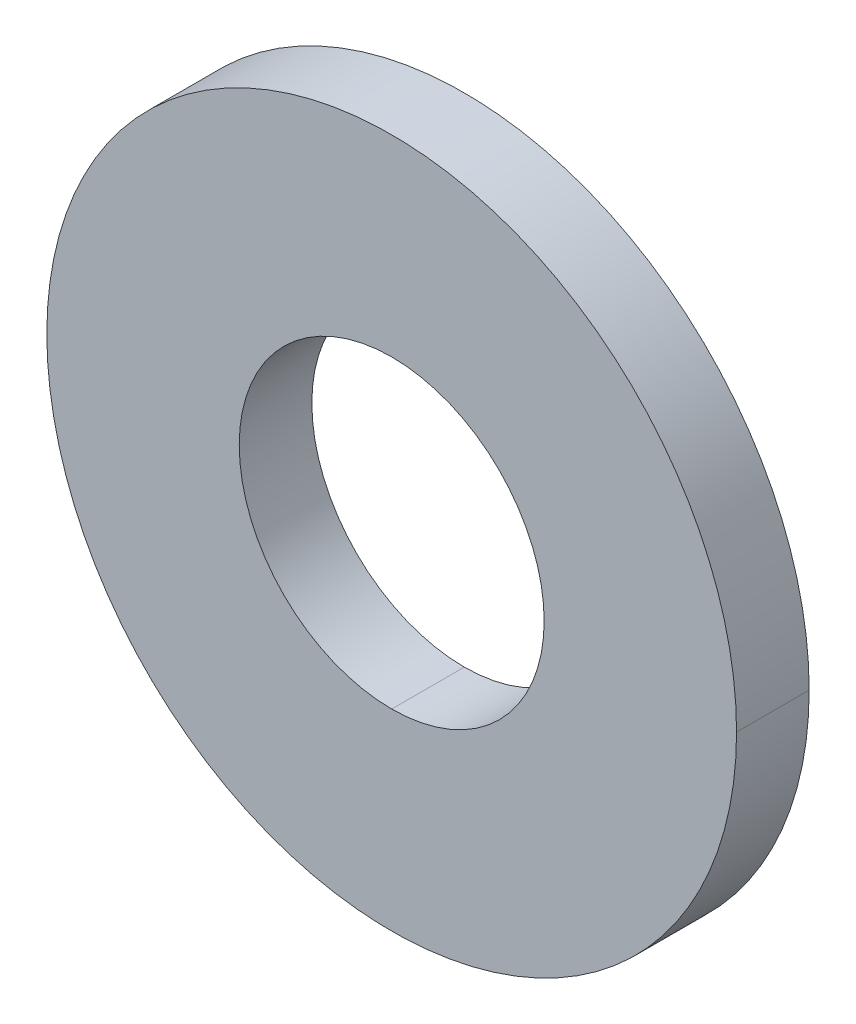
ISO-10303-21;
HEADER;
FILE_DESCRIPTION(('STEP AP214'),'2;1');
FILE_NAME('part.step','',(''),(''),'','','');
FILE_SCHEMA(('AUTOMOTIVE_DESIGN { 1 0 10303 214 1 1 1 1 }'));
ENDSEC;
DATA;
#1=APPLICATION_CONTEXT('core data for automotive mechanical design processes');
#2=APPLICATION_PROTOCOL_DEFINITION('international standard','automotive_design',2000,#1);
#3=PRODUCT_CONTEXT('',#1,'mechanical');
#4=PRODUCT('Part','Part','',(#3));
#5=PRODUCT_RELATED_PRODUCT_CATEGORY('part','',(#4));
#6=PRODUCT_DEFINITION_FORMATION('','',#4);
#7=PRODUCT_DEFINITION_CONTEXT('part definition',#1,'design');
#8=PRODUCT_DEFINITION('design','',#6,#7);
#9=PRODUCT_DEFINITION_SHAPE('','',#8);
#10=(LENGTH_UNIT() NAMED_UNIT(*) SI_UNIT(.MILLI.,.METRE.));
#11=(NAMED_UNIT(*) PLANE_ANGLE_UNIT() SI_UNIT($,.RADIAN.));
#12=(NAMED_UNIT(*) SI_UNIT($,.STERADIAN.) SOLID_ANGLE_UNIT());
#13=UNCERTAINTY_MEASURE_WITH_UNIT(LENGTH_MEASURE(1.E-05),#10,'distance_accuracy_value','');
#14=(GEOMETRIC_REPRESENTATION_CONTEXT(3) GLOBAL_UNCERTAINTY_ASSIGNED_CONTEXT((#13)) GLOBAL_UNIT_ASSIGNED_CONTEXT((#10,
#11,#12)) REPRESENTATION_CONTEXT('',''));
#15=CARTESIAN_POINT('',(0.,0.,0.));
#16=DIRECTION('',(0.,0.,1.));
#17=DIRECTION('',(1.,0.,0.));
#18=AXIS2_PLACEMENT_3D('',#15,#16,#17);
#19=CARTESIAN_POINT('',(0.,0.,0.));
#20=DIRECTION('',(0.,0.,-1.));
#21=DIRECTION('',(0.,-1.,0.));
#22=AXIS2_PLACEMENT_3D('',#19,#20,#21);
#23=PLANE('',#22);
#24=CARTESIAN_POINT('',(0.,0.,0.));
#25=DIRECTION('',(0.,0.,-1.));
#26=DIRECTION('',(1.,0.,0.));
#27=AXIS2_PLACEMENT_3D('',#24,#25,#26);
#28=CIRCLE('',#27,4.75);
#29=CARTESIAN_POINT('',(4.75,0.,0.));
#30=VERTEX_POINT('',#29);
#31=CARTESIAN_POINT('',(-4.75,0.,0.));
#32=VERTEX_POINT('',#31);
#33=EDGE_CURVE('E11',#30,#32,#28,.T.);
#34=ORIENTED_EDGE('',*,*,#33,.T.);
#35=CARTESIAN_POINT('',(0.,0.,0.));
#36=DIRECTION('',(0.,0.,-1.));
#37=DIRECTION('',(1.,0.,0.));
#38=AXIS2_PLACEMENT_3D('',#35,#36,#37);
#39=CIRCLE('',#38,4.75);
#40=EDGE_CURVE('E27',#32,#30,#39,.T.);
#41=ORIENTED_EDGE('',*,*,#40,.T.);
#42=EDGE_LOOP('',(#34,#41));
#43=FACE_BOUND('',#42,.T.);
#44=CARTESIAN_POINT('',(0.,0.,0.));
#45=DIRECTION('',(0.,0.,-1.));
#46=DIRECTION('',(1.,0.,0.));
#47=AXIS2_PLACEMENT_3D('',#44,#45,#46);
#48=CIRCLE('',#47,2.09999999963);
#49=CARTESIAN_POINT('',(0.,2.09999999963,0.));
#50=VERTEX_POINT('',#49);
#51=CARTESIAN_POINT('',(2.09999999963,0.,0.));
#52=VERTEX_POINT('',#51);
#53=EDGE_CURVE('E88',#50,#52,#48,.T.);
#54=ORIENTED_EDGE('',*,*,#53,.F.);
#55=CARTESIAN_POINT('',(0.,0.,0.));
#56=DIRECTION('',(0.,0.,-1.));
#57=DIRECTION('',(1.,0.,0.));
#58=AXIS2_PLACEMENT_3D('',#55,#56,#57);
#59=CIRCLE('',#58,2.09999999963);
#60=CARTESIAN_POINT('',(-2.09999999963,0.,0.));
#61=VERTEX_POINT('',#60);
#62=EDGE_CURVE('E104',#61,#50,#59,.T.);
#63=ORIENTED_EDGE('',*,*,#62,.F.);
#64=CARTESIAN_POINT('',(0.,0.,0.));
#65=DIRECTION('',(0.,0.,-1.));
#66=DIRECTION('',(1.,0.,0.));
#67=AXIS2_PLACEMENT_3D('',#64,#65,#66);
#68=CIRCLE('',#67,2.09999999963);
#69=CARTESIAN_POINT('',(0.,-2.09999999963,0.));
#70=VERTEX_POINT('',#69);
#71=EDGE_CURVE('E80',#70,#61,#68,.T.);
#72=ORIENTED_EDGE('',*,*,#71,.F.);
#73=CARTESIAN_POINT('',(0.,0.,0.));
#74=DIRECTION('',(0.,0.,-1.));
#75=DIRECTION('',(1.,0.,0.));
#76=AXIS2_PLACEMENT_3D('',#73,#74,#75);
#77=CIRCLE('',#76,2.09999999963);
#78=EDGE_CURVE('E91',#52,#70,#77,.T.);
#79=ORIENTED_EDGE('',*,*,#78,.F.);
#80=EDGE_LOOP('',(#54,#63,#72,#79));
#81=FACE_BOUND('',#80,.T.);
#82=ADVANCED_FACE('F16',(#43,#81),#23,.T.);
#83=CARTESIAN_POINT('',(0.,0.,1.));
#84=DIRECTION('',(0.,0.,1.));
#85=DIRECTION('',(-1.,0.,0.));
#86=AXIS2_PLACEMENT_3D('',#83,#84,#85);
#87=CYLINDRICAL_SURFACE('',#86,4.75);
#88=DIRECTION('',(0.,0.,-1.));
#89=VECTOR('',#88,1.);
#90=CARTESIAN_POINT('',(-4.75,0.,1.));
#91=LINE('',#90,#89);
#92=CARTESIAN_POINT('',(-4.75,0.,1.));
#93=VERTEX_POINT('',#92);
#94=EDGE_CURVE('E121',#93,#32,#91,.T.);
#95=ORIENTED_EDGE('',*,*,#94,.T.);
#96=ORIENTED_EDGE('',*,*,#33,.F.);
#97=DIRECTION('',(0.,0.,1.));
#98=VECTOR('',#97,1.);
#99=CARTESIAN_POINT('',(4.75,0.,1.));
#100=LINE('',#99,#98);
#101=CARTESIAN_POINT('',(4.75,0.,1.));
#102=VERTEX_POINT('',#101);
#103=EDGE_CURVE('E20',#30,#102,#100,.T.);
#104=ORIENTED_EDGE('',*,*,#103,.T.);
#105=CARTESIAN_POINT('',(0.,0.,1.));
#106=DIRECTION('',(0.,0.,-1.));
#107=DIRECTION('',(1.,0.,0.));
#108=AXIS2_PLACEMENT_3D('',#105,#106,#107);
#109=CIRCLE('',#108,4.75);
#110=EDGE_CURVE('E128',#102,#93,#109,.T.);
#111=ORIENTED_EDGE('',*,*,#110,.T.);
#112=EDGE_LOOP('',(#95,#96,#104,#111));
#113=FACE_BOUND('',#112,.T.);
#114=ADVANCED_FACE('F196',(#113),#87,.T.);
#115=CARTESIAN_POINT('',(0.,0.,1.));
#116=DIRECTION('',(0.,0.,1.));
#117=DIRECTION('',(1.,0.,0.));
#118=AXIS2_PLACEMENT_3D('',#115,#116,#117);
#119=CYLINDRICAL_SURFACE('',#118,4.75);
#120=ORIENTED_EDGE('',*,*,#103,.F.);
#121=ORIENTED_EDGE('',*,*,#40,.F.);
#122=ORIENTED_EDGE('',*,*,#94,.F.);
#123=CARTESIAN_POINT('',(0.,0.,1.));
#124=DIRECTION('',(0.,0.,-1.));
#125=DIRECTION('',(1.,0.,0.));
#126=AXIS2_PLACEMENT_3D('',#123,#124,#125);
#127=CIRCLE('',#126,4.75);
#128=EDGE_CURVE('E97',#93,#102,#127,.T.);
#129=ORIENTED_EDGE('',*,*,#128,.T.);
#130=EDGE_LOOP('',(#120,#121,#122,#129));
#131=FACE_BOUND('',#130,.T.);
#132=ADVANCED_FACE('F18',(#131),#119,.T.);
#133=CARTESIAN_POINT('',(0.,0.,1.));
#134=DIRECTION('',(0.,0.,1.));
#135=DIRECTION('',(0.,-1.,0.));
#136=AXIS2_PLACEMENT_3D('',#133,#134,#135);
#137=CYLINDRICAL_SURFACE('',#136,2.1);
#138=ORIENTED_EDGE('',*,*,#53,.T.);
#139=ORIENTED_EDGE('',*,*,#78,.T.);
#140=DIRECTION('',(0.,0.,-1.));
#141=VECTOR('',#140,1.);
#142=CARTESIAN_POINT('',(0.,-2.1,1.));
#143=LINE('',#142,#141);
#144=CARTESIAN_POINT('',(0.,-2.09999999963,1.));
#145=VERTEX_POINT('',#144);
#146=EDGE_CURVE('E108',#145,#70,#143,.T.);
#147=ORIENTED_EDGE('',*,*,#146,.F.);
#148=CARTESIAN_POINT('',(0.,0.,1.));
#149=DIRECTION('',(0.,0.,-1.));
#150=DIRECTION('',(1.,0.,0.));
#151=AXIS2_PLACEMENT_3D('',#148,#149,#150);
#152=CIRCLE('',#151,2.1);
#153=CARTESIAN_POINT('',(2.09999999963,0.,1.));
#154=VERTEX_POINT('',#153);
#155=EDGE_CURVE('E111',#154,#145,#152,.T.);
#156=ORIENTED_EDGE('',*,*,#155,.F.);
#157=CARTESIAN_POINT('',(0.,0.,1.));
#158=DIRECTION('',(0.,0.,-1.));
#159=DIRECTION('',(1.,0.,0.));
#160=AXIS2_PLACEMENT_3D('',#157,#158,#159);
#161=CIRCLE('',#160,2.1);
#162=CARTESIAN_POINT('',(0.,2.09999999963,1.));
#163=VERTEX_POINT('',#162);
#164=EDGE_CURVE('E112',#163,#154,#161,.T.);
#165=ORIENTED_EDGE('',*,*,#164,.F.);
#166=DIRECTION('',(0.,0.,1.));
#167=VECTOR('',#166,1.);
#168=CARTESIAN_POINT('',(0.,2.1,1.));
#169=LINE('',#168,#167);
#170=EDGE_CURVE('E95',#50,#163,#169,.T.);
#171=ORIENTED_EDGE('',*,*,#170,.F.);
#172=EDGE_LOOP('',(#138,#139,#147,#156,#165,#171));
#173=FACE_BOUND('',#172,.T.);
#174=ADVANCED_FACE('F89',(#173),#137,.F.);
#175=CARTESIAN_POINT('',(0.,0.,1.));
#176=DIRECTION('',(0.,0.,1.));
#177=DIRECTION('',(0.,1.,0.));
#178=AXIS2_PLACEMENT_3D('',#175,#176,#177);
#179=CYLINDRICAL_SURFACE('',#178,2.1);
#180=ORIENTED_EDGE('',*,*,#71,.T.);
#181=ORIENTED_EDGE('',*,*,#62,.T.);
#182=ORIENTED_EDGE('',*,*,#170,.T.);
#183=CARTESIAN_POINT('',(0.,0.,1.));
#184=DIRECTION('',(0.,0.,-1.));
#185=DIRECTION('',(1.,0.,0.));
#186=AXIS2_PLACEMENT_3D('',#183,#184,#185);
#187=CIRCLE('',#186,2.1);
#188=CARTESIAN_POINT('',(-2.09999999963,0.,1.));
#189=VERTEX_POINT('',#188);
#190=EDGE_CURVE('E116',#189,#163,#187,.T.);
#191=ORIENTED_EDGE('',*,*,#190,.F.);
#192=CARTESIAN_POINT('',(0.,0.,1.));
#193=DIRECTION('',(0.,0.,-1.));
#194=DIRECTION('',(1.,0.,0.));
#195=AXIS2_PLACEMENT_3D('',#192,#193,#194);
#196=CIRCLE('',#195,2.1);
#197=EDGE_CURVE('E117',#145,#189,#196,.T.);
#198=ORIENTED_EDGE('',*,*,#197,.F.);
#199=ORIENTED_EDGE('',*,*,#146,.T.);
#200=EDGE_LOOP('',(#180,#181,#182,#191,#198,#199));
#201=FACE_BOUND('',#200,.T.);
#202=ADVANCED_FACE('F141',(#201),#179,.F.);
#203=CARTESIAN_POINT('',(0.,0.,1.));
#204=DIRECTION('',(0.,0.,-1.));
#205=DIRECTION('',(0.,-1.,0.));
#206=AXIS2_PLACEMENT_3D('',#203,#204,#205);
#207=PLANE('',#206);
#208=ORIENTED_EDGE('',*,*,#128,.F.);
#209=ORIENTED_EDGE('',*,*,#110,.F.);
#210=EDGE_LOOP('',(#208,#209));
#211=FACE_BOUND('',#210,.T.);
#212=ORIENTED_EDGE('',*,*,#155,.T.);
#213=ORIENTED_EDGE('',*,*,#197,.T.);
#214=ORIENTED_EDGE('',*,*,#190,.T.);
#215=ORIENTED_EDGE('',*,*,#164,.T.);
#216=EDGE_LOOP('',(#212,#213,#214,#215));
#217=FACE_BOUND('',#216,.T.);
#218=ADVANCED_FACE('F144',(#211,#217),#207,.F.);
#219=CLOSED_SHELL('',(#82,#114,#132,#174,#202,#218));
#220=MANIFOLD_SOLID_BREP('B1',#219);
#221=ADVANCED_BREP_SHAPE_REPRESENTATION('',(#18,#220),#14);
#222=SHAPE_DEFINITION_REPRESENTATION(#9,#221);
ENDSEC;
END-ISO-10303-21;
